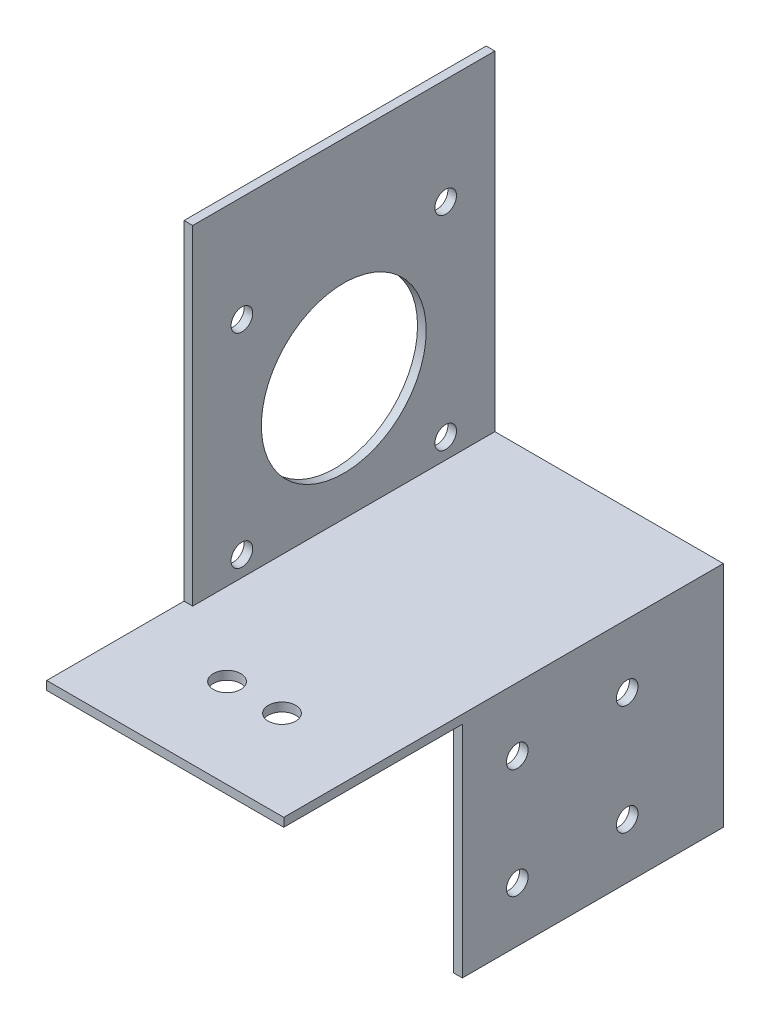
ISO-10303-21;
HEADER;
FILE_DESCRIPTION(('STEP AP214'),'2;1');
FILE_NAME('part.step','',(''),(''),'','','');
FILE_SCHEMA(('AUTOMOTIVE_DESIGN { 1 0 10303 214 1 1 1 1 }'));
ENDSEC;
DATA;
#1=APPLICATION_CONTEXT('core data for automotive mechanical design processes');
#2=APPLICATION_PROTOCOL_DEFINITION('international standard','automotive_design',2000,#1);
#3=PRODUCT_CONTEXT('',#1,'mechanical');
#4=PRODUCT('Part','Part','',(#3));
#5=PRODUCT_RELATED_PRODUCT_CATEGORY('part','',(#4));
#6=PRODUCT_DEFINITION_FORMATION('','',#4);
#7=PRODUCT_DEFINITION_CONTEXT('part definition',#1,'design');
#8=PRODUCT_DEFINITION('design','',#6,#7);
#9=PRODUCT_DEFINITION_SHAPE('','',#8);
#10=(LENGTH_UNIT() NAMED_UNIT(*) SI_UNIT(.MILLI.,.METRE.));
#11=(NAMED_UNIT(*) PLANE_ANGLE_UNIT() SI_UNIT($,.RADIAN.));
#12=(NAMED_UNIT(*) SI_UNIT($,.STERADIAN.) SOLID_ANGLE_UNIT());
#13=UNCERTAINTY_MEASURE_WITH_UNIT(LENGTH_MEASURE(1.E-05),#10,'distance_accuracy_value','');
#14=(GEOMETRIC_REPRESENTATION_CONTEXT(3) GLOBAL_UNCERTAINTY_ASSIGNED_CONTEXT((#13)) GLOBAL_UNIT_ASSIGNED_CONTEXT((#10,
#11,#12)) REPRESENTATION_CONTEXT('',''));
#15=CARTESIAN_POINT('',(0.,0.,0.));
#16=DIRECTION('',(0.,0.,1.));
#17=DIRECTION('',(1.,0.,0.));
#18=AXIS2_PLACEMENT_3D('',#15,#16,#17);
#19=CARTESIAN_POINT('',(-54.8,27.4,25.4));
#20=DIRECTION('',(0.,0.,-1.));
#21=DIRECTION('',(0.,1.,0.));
#22=AXIS2_PLACEMENT_3D('',#19,#20,#21);
#23=PLANE('',#22);
#24=DIRECTION('',(1.,0.,0.));
#25=VECTOR('',#24,1.);
#26=CARTESIAN_POINT('',(-54.8,25.4,25.4));
#27=LINE('',#26,#25);
#28=CARTESIAN_POINT('',(-2.,25.4,25.4));
#29=VERTEX_POINT('',#28);
#30=CARTESIAN_POINT('',(0.,25.4,25.4));
#31=VERTEX_POINT('',#30);
#32=EDGE_CURVE('E11',#29,#31,#27,.T.);
#33=ORIENTED_EDGE('',*,*,#32,.F.);
#34=DIRECTION('',(0.,-1.,0.));
#35=VECTOR('',#34,1.);
#36=CARTESIAN_POINT('',(-2.,0.,25.4));
#37=LINE('',#36,#35);
#38=CARTESIAN_POINT('',(-2.,-25.4,25.4));
#39=VERTEX_POINT('',#38);
#40=EDGE_CURVE('E175',#29,#39,#37,.T.);
#41=ORIENTED_EDGE('',*,*,#40,.T.);
#42=DIRECTION('',(1.,0.,0.));
#43=VECTOR('',#42,1.);
#44=CARTESIAN_POINT('',(-54.8,-25.4,25.4));
#45=LINE('',#44,#43);
#46=CARTESIAN_POINT('',(0.,-25.4,25.4));
#47=VERTEX_POINT('',#46);
#48=EDGE_CURVE('E170',#39,#47,#45,.T.);
#49=ORIENTED_EDGE('',*,*,#48,.T.);
#50=DIRECTION('',(0.,1.,0.));
#51=VECTOR('',#50,1.);
#52=CARTESIAN_POINT('',(0.,27.4,25.4));
#53=LINE('',#52,#51);
#54=EDGE_CURVE('E167',#47,#31,#53,.T.);
#55=ORIENTED_EDGE('',*,*,#54,.T.);
#56=EDGE_LOOP('',(#33,#41,#49,#55));
#57=FACE_BOUND('',#56,.T.);
#58=ADVANCED_FACE('F39',(#57),#23,.F.);
#59=CARTESIAN_POINT('',(0.,27.4,0.));
#60=DIRECTION('',(0.,-1.,0.));
#61=DIRECTION('',(0.,0.,-1.));
#62=AXIS2_PLACEMENT_3D('',#59,#60,#61);
#63=PLANE('',#62);
#64=CARTESIAN_POINT('',(-33.75,27.4,46.0375));
#65=DIRECTION('',(0.,1.,0.));
#66=DIRECTION('',(0.,0.,1.));
#67=AXIS2_PLACEMENT_3D('',#64,#65,#66);
#68=CIRCLE('',#67,3.175);
#69=CARTESIAN_POINT('',(-33.75,27.4,49.2125));
#70=VERTEX_POINT('',#69);
#71=EDGE_CURVE('E307',#70,#70,#68,.T.);
#72=ORIENTED_EDGE('',*,*,#71,.F.);
#73=EDGE_LOOP('',(#72));
#74=FACE_BOUND('',#73,.T.);
#75=CARTESIAN_POINT('',(-21.05,27.4,46.0375));
#76=DIRECTION('',(0.,1.,0.));
#77=DIRECTION('',(0.,0.,1.));
#78=AXIS2_PLACEMENT_3D('',#75,#76,#77);
#79=CIRCLE('',#78,3.175);
#80=CARTESIAN_POINT('',(-21.05,27.4,49.2125));
#81=VERTEX_POINT('',#80);
#82=EDGE_CURVE('E154',#81,#81,#79,.T.);
#83=ORIENTED_EDGE('',*,*,#82,.F.);
#84=EDGE_LOOP('',(#83));
#85=FACE_BOUND('',#84,.T.);
#86=DIRECTION('',(-1.,0.,0.));
#87=VECTOR('',#86,1.);
#88=CARTESIAN_POINT('',(0.,27.4,-34.925));
#89=LINE('',#88,#87);
#90=CARTESIAN_POINT('',(0.,27.4,-34.925));
#91=VERTEX_POINT('',#90);
#92=CARTESIAN_POINT('',(-52.8,27.4,-34.925));
#93=VERTEX_POINT('',#92);
#94=EDGE_CURVE('E129',#91,#93,#89,.T.);
#95=ORIENTED_EDGE('',*,*,#94,.T.);
#96=DIRECTION('',(0.,0.,-1.));
#97=VECTOR('',#96,1.);
#98=CARTESIAN_POINT('',(-52.8,27.4,-34.925));
#99=LINE('',#98,#97);
#100=CARTESIAN_POINT('',(-52.8,27.4,34.925));
#101=VERTEX_POINT('',#100);
#102=EDGE_CURVE('E247',#101,#93,#99,.T.);
#103=ORIENTED_EDGE('',*,*,#102,.F.);
#104=DIRECTION('',(1.,0.,0.));
#105=VECTOR('',#104,1.);
#106=CARTESIAN_POINT('',(-54.8,27.4,34.925));
#107=LINE('',#106,#105);
#108=CARTESIAN_POINT('',(-54.8,27.4,34.925));
#109=VERTEX_POINT('',#108);
#110=EDGE_CURVE('E172',#109,#101,#107,.T.);
#111=ORIENTED_EDGE('',*,*,#110,.F.);
#112=DIRECTION('',(0.,0.,-1.));
#113=VECTOR('',#112,1.);
#114=CARTESIAN_POINT('',(-54.8,27.4,66.675));
#115=LINE('',#114,#113);
#116=CARTESIAN_POINT('',(-54.8,27.4,66.675));
#117=VERTEX_POINT('',#116);
#118=EDGE_CURVE('E137',#117,#109,#115,.T.);
#119=ORIENTED_EDGE('',*,*,#118,.F.);
#120=DIRECTION('',(-1.,0.,0.));
#121=VECTOR('',#120,1.);
#122=CARTESIAN_POINT('',(0.,27.4,66.675));
#123=LINE('',#122,#121);
#124=CARTESIAN_POINT('',(0.,27.4,66.675));
#125=VERTEX_POINT('',#124);
#126=EDGE_CURVE('E133',#125,#117,#123,.T.);
#127=ORIENTED_EDGE('',*,*,#126,.F.);
#128=DIRECTION('',(0.,0.,-1.));
#129=VECTOR('',#128,1.);
#130=CARTESIAN_POINT('',(0.,27.4,-34.925));
#131=LINE('',#130,#129);
#132=EDGE_CURVE('E116',#125,#91,#131,.T.);
#133=ORIENTED_EDGE('',*,*,#132,.T.);
#134=EDGE_LOOP('',(#95,#103,#111,#119,#127,#133));
#135=FACE_BOUND('',#134,.T.);
#136=ADVANCED_FACE('F134',(#74,#85,#135),#63,.F.);
#137=CARTESIAN_POINT('',(-2.,-25.4,-34.925));
#138=DIRECTION('',(0.,0.,-1.));
#139=DIRECTION('',(-1.,0.,0.));
#140=AXIS2_PLACEMENT_3D('',#137,#138,#139);
#141=PLANE('',#140);
#142=DIRECTION('',(0.,1.,0.));
#143=VECTOR('',#142,1.);
#144=CARTESIAN_POINT('',(0.,-25.4,-34.925));
#145=LINE('',#144,#143);
#146=CARTESIAN_POINT('',(0.,-25.4,-34.925));
#147=VERTEX_POINT('',#146);
#148=EDGE_CURVE('E124',#147,#91,#145,.T.);
#149=ORIENTED_EDGE('',*,*,#148,.F.);
#150=DIRECTION('',(1.,0.,0.));
#151=VECTOR('',#150,1.);
#152=CARTESIAN_POINT('',(-2.,-25.4,-34.925));
#153=LINE('',#152,#151);
#154=CARTESIAN_POINT('',(-2.,-25.4,-34.925));
#155=VERTEX_POINT('',#154);
#156=EDGE_CURVE('E50',#155,#147,#153,.T.);
#157=ORIENTED_EDGE('',*,*,#156,.F.);
#158=DIRECTION('',(0.,1.,0.));
#159=VECTOR('',#158,1.);
#160=CARTESIAN_POINT('',(-2.,-25.4,-34.925));
#161=LINE('',#160,#159);
#162=CARTESIAN_POINT('',(-2.,25.4,-34.925));
#163=VERTEX_POINT('',#162);
#164=EDGE_CURVE('E289',#155,#163,#161,.T.);
#165=ORIENTED_EDGE('',*,*,#164,.T.);
#166=DIRECTION('',(-1.,0.,0.));
#167=VECTOR('',#166,1.);
#168=CARTESIAN_POINT('',(0.,25.4,-34.925));
#169=LINE('',#168,#167);
#170=CARTESIAN_POINT('',(-54.8,25.4,-34.925));
#171=VERTEX_POINT('',#170);
#172=EDGE_CURVE('E274',#163,#171,#169,.T.);
#173=ORIENTED_EDGE('',*,*,#172,.T.);
#174=DIRECTION('',(0.,-1.,0.));
#175=VECTOR('',#174,1.);
#176=CARTESIAN_POINT('',(-54.8,27.4,-34.925));
#177=LINE('',#176,#175);
#178=CARTESIAN_POINT('',(-54.8,103.6,-34.925));
#179=VERTEX_POINT('',#178);
#180=EDGE_CURVE('E285',#179,#171,#177,.T.);
#181=ORIENTED_EDGE('',*,*,#180,.F.);
#182=DIRECTION('',(-1.,0.,0.));
#183=VECTOR('',#182,1.);
#184=CARTESIAN_POINT('',(-54.8,103.6,-34.925));
#185=LINE('',#184,#183);
#186=CARTESIAN_POINT('',(-52.8,103.6,-34.925));
#187=VERTEX_POINT('',#186);
#188=EDGE_CURVE('E261',#187,#179,#185,.T.);
#189=ORIENTED_EDGE('',*,*,#188,.F.);
#190=DIRECTION('',(0.,-1.,0.));
#191=VECTOR('',#190,1.);
#192=CARTESIAN_POINT('',(-52.8,103.6,-34.925));
#193=LINE('',#192,#191);
#194=EDGE_CURVE('E265',#187,#93,#193,.T.);
#195=ORIENTED_EDGE('',*,*,#194,.T.);
#196=ORIENTED_EDGE('',*,*,#94,.F.);
#197=EDGE_LOOP('',(#149,#157,#165,#173,#181,#189,#195,#196));
#198=FACE_BOUND('',#197,.T.);
#199=ADVANCED_FACE('F41',(#198),#141,.T.);
#200=CARTESIAN_POINT('',(-2.,-25.4,34.925));
#201=DIRECTION('',(0.,-1.,0.));
#202=DIRECTION('',(0.,0.,-1.));
#203=AXIS2_PLACEMENT_3D('',#200,#201,#202);
#204=PLANE('',#203);
#205=ORIENTED_EDGE('',*,*,#48,.F.);
#206=DIRECTION('',(0.,0.,-1.));
#207=VECTOR('',#206,1.);
#208=CARTESIAN_POINT('',(-2.,-25.4,34.925));
#209=LINE('',#208,#207);
#210=EDGE_CURVE('E58',#39,#155,#209,.T.);
#211=ORIENTED_EDGE('',*,*,#210,.T.);
#212=ORIENTED_EDGE('',*,*,#156,.T.);
#213=DIRECTION('',(0.,0.,-1.));
#214=VECTOR('',#213,1.);
#215=CARTESIAN_POINT('',(0.,-25.4,34.925));
#216=LINE('',#215,#214);
#217=EDGE_CURVE('E294',#47,#147,#216,.T.);
#218=ORIENTED_EDGE('',*,*,#217,.F.);
#219=EDGE_LOOP('',(#205,#211,#212,#218));
#220=FACE_BOUND('',#219,.T.);
#221=ADVANCED_FACE('F327',(#220),#204,.T.);
#222=CARTESIAN_POINT('',(-2.,-25.4,34.925));
#223=DIRECTION('',(0.,0.,1.));
#224=DIRECTION('',(1.,0.,0.));
#225=AXIS2_PLACEMENT_3D('',#222,#223,#224);
#226=PLANE('',#225);
#227=ORIENTED_EDGE('',*,*,#110,.T.);
#228=DIRECTION('',(0.,-1.,0.));
#229=VECTOR('',#228,1.);
#230=CARTESIAN_POINT('',(-52.8,103.6,34.925));
#231=LINE('',#230,#229);
#232=CARTESIAN_POINT('',(-52.8,103.6,34.925));
#233=VERTEX_POINT('',#232);
#234=EDGE_CURVE('E271',#233,#101,#231,.T.);
#235=ORIENTED_EDGE('',*,*,#234,.F.);
#236=DIRECTION('',(1.,0.,0.));
#237=VECTOR('',#236,1.);
#238=CARTESIAN_POINT('',(-54.8,103.6,34.925));
#239=LINE('',#238,#237);
#240=CARTESIAN_POINT('',(-54.8,103.6,34.925));
#241=VERTEX_POINT('',#240);
#242=EDGE_CURVE('E255',#241,#233,#239,.T.);
#243=ORIENTED_EDGE('',*,*,#242,.F.);
#244=DIRECTION('',(0.,-1.,0.));
#245=VECTOR('',#244,1.);
#246=CARTESIAN_POINT('',(-54.8,27.4,34.925));
#247=LINE('',#246,#245);
#248=EDGE_CURVE('E278',#241,#109,#247,.T.);
#249=ORIENTED_EDGE('',*,*,#248,.T.);
#250=EDGE_LOOP('',(#227,#235,#243,#249));
#251=FACE_BOUND('',#250,.T.);
#252=ADVANCED_FACE('F346',(#251),#226,.T.);
#253=CARTESIAN_POINT('',(-2.,0.,0.));
#254=DIRECTION('',(-1.,0.,0.));
#255=DIRECTION('',(0.,0.,1.));
#256=AXIS2_PLACEMENT_3D('',#253,#254,#255);
#257=PLANE('',#256);
#258=ORIENTED_EDGE('',*,*,#40,.F.);
#259=DIRECTION('',(0.,0.,1.));
#260=VECTOR('',#259,1.);
#261=CARTESIAN_POINT('',(-2.,25.4,34.925));
#262=LINE('',#261,#260);
#263=EDGE_CURVE('E293',#163,#29,#262,.T.);
#264=ORIENTED_EDGE('',*,*,#263,.F.);
#265=ORIENTED_EDGE('',*,*,#164,.F.);
#266=ORIENTED_EDGE('',*,*,#210,.F.);
#267=EDGE_LOOP('',(#258,#264,#265,#266));
#268=FACE_BOUND('',#267,.T.);
#269=CARTESIAN_POINT('',(-2.,12.7,12.7));
#270=DIRECTION('',(-1.,0.,0.));
#271=DIRECTION('',(0.,0.,1.));
#272=AXIS2_PLACEMENT_3D('',#269,#270,#271);
#273=CIRCLE('',#272,2.5);
#274=CARTESIAN_POINT('',(-2.,12.7,15.2));
#275=VERTEX_POINT('',#274);
#276=EDGE_CURVE('E206',#275,#275,#273,.T.);
#277=ORIENTED_EDGE('',*,*,#276,.F.);
#278=EDGE_LOOP('',(#277));
#279=FACE_BOUND('',#278,.T.);
#280=CARTESIAN_POINT('',(-2.,12.7,-12.7));
#281=DIRECTION('',(-1.,0.,0.));
#282=DIRECTION('',(0.,0.,1.));
#283=AXIS2_PLACEMENT_3D('',#280,#281,#282);
#284=CIRCLE('',#283,2.5);
#285=CARTESIAN_POINT('',(-2.,12.7,-10.2));
#286=VERTEX_POINT('',#285);
#287=EDGE_CURVE('E202',#286,#286,#284,.T.);
#288=ORIENTED_EDGE('',*,*,#287,.F.);
#289=EDGE_LOOP('',(#288));
#290=FACE_BOUND('',#289,.T.);
#291=CARTESIAN_POINT('',(-2.,-12.7,-12.7));
#292=DIRECTION('',(-1.,0.,0.));
#293=DIRECTION('',(0.,0.,1.));
#294=AXIS2_PLACEMENT_3D('',#291,#292,#293);
#295=CIRCLE('',#294,2.5);
#296=CARTESIAN_POINT('',(-2.,-12.7,-10.2));
#297=VERTEX_POINT('',#296);
#298=EDGE_CURVE('E198',#297,#297,#295,.T.);
#299=ORIENTED_EDGE('',*,*,#298,.F.);
#300=EDGE_LOOP('',(#299));
#301=FACE_BOUND('',#300,.T.);
#302=CARTESIAN_POINT('',(-2.,-12.7,12.7));
#303=DIRECTION('',(-1.,0.,0.));
#304=DIRECTION('',(0.,0.,1.));
#305=AXIS2_PLACEMENT_3D('',#302,#303,#304);
#306=CIRCLE('',#305,2.5);
#307=CARTESIAN_POINT('',(-2.,-12.7,15.2));
#308=VERTEX_POINT('',#307);
#309=EDGE_CURVE('E194',#308,#308,#306,.T.);
#310=ORIENTED_EDGE('',*,*,#309,.F.);
#311=EDGE_LOOP('',(#310));
#312=FACE_BOUND('',#311,.T.);
#313=ADVANCED_FACE('F343',(#268,#279,#290,#301,#312),#257,.T.);
#314=CARTESIAN_POINT('',(0.,0.,0.));
#315=DIRECTION('',(-1.,0.,0.));
#316=DIRECTION('',(0.,0.,1.));
#317=AXIS2_PLACEMENT_3D('',#314,#315,#316);
#318=PLANE('',#317);
#319=CARTESIAN_POINT('',(0.,12.7,12.7));
#320=DIRECTION('',(1.,0.,0.));
#321=DIRECTION('',(0.,0.,-1.));
#322=AXIS2_PLACEMENT_3D('',#319,#320,#321);
#323=CIRCLE('',#322,2.5);
#324=CARTESIAN_POINT('',(0.,12.7,10.2));
#325=VERTEX_POINT('',#324);
#326=EDGE_CURVE('E171',#325,#325,#323,.T.);
#327=ORIENTED_EDGE('',*,*,#326,.F.);
#328=EDGE_LOOP('',(#327));
#329=FACE_BOUND('',#328,.T.);
#330=CARTESIAN_POINT('',(0.,12.7,-12.7));
#331=DIRECTION('',(1.,0.,0.));
#332=DIRECTION('',(0.,0.,-1.));
#333=AXIS2_PLACEMENT_3D('',#330,#331,#332);
#334=CIRCLE('',#333,2.5);
#335=CARTESIAN_POINT('',(0.,12.7,-15.2));
#336=VERTEX_POINT('',#335);
#337=EDGE_CURVE('E181',#336,#336,#334,.T.);
#338=ORIENTED_EDGE('',*,*,#337,.F.);
#339=EDGE_LOOP('',(#338));
#340=FACE_BOUND('',#339,.T.);
#341=CARTESIAN_POINT('',(0.,-12.7,-12.7));
#342=DIRECTION('',(1.,0.,0.));
#343=DIRECTION('',(0.,0.,-1.));
#344=AXIS2_PLACEMENT_3D('',#341,#342,#343);
#345=CIRCLE('',#344,2.5);
#346=CARTESIAN_POINT('',(0.,-12.7,-15.2));
#347=VERTEX_POINT('',#346);
#348=EDGE_CURVE('E185',#347,#347,#345,.T.);
#349=ORIENTED_EDGE('',*,*,#348,.F.);
#350=EDGE_LOOP('',(#349));
#351=FACE_BOUND('',#350,.T.);
#352=CARTESIAN_POINT('',(0.,-12.7,12.7));
#353=DIRECTION('',(1.,0.,0.));
#354=DIRECTION('',(0.,0.,-1.));
#355=AXIS2_PLACEMENT_3D('',#352,#353,#354);
#356=CIRCLE('',#355,2.5);
#357=CARTESIAN_POINT('',(0.,-12.7,10.2));
#358=VERTEX_POINT('',#357);
#359=EDGE_CURVE('E166',#358,#358,#356,.T.);
#360=ORIENTED_EDGE('',*,*,#359,.F.);
#361=EDGE_LOOP('',(#360));
#362=FACE_BOUND('',#361,.T.);
#363=ORIENTED_EDGE('',*,*,#132,.F.);
#364=DIRECTION('',(0.,1.,0.));
#365=VECTOR('',#364,1.);
#366=CARTESIAN_POINT('',(0.,27.4,66.675));
#367=LINE('',#366,#365);
#368=CARTESIAN_POINT('',(0.,25.4,66.675));
#369=VERTEX_POINT('',#368);
#370=EDGE_CURVE('E121',#369,#125,#367,.T.);
#371=ORIENTED_EDGE('',*,*,#370,.F.);
#372=DIRECTION('',(0.,0.,-1.));
#373=VECTOR('',#372,1.);
#374=CARTESIAN_POINT('',(0.,25.4,66.675));
#375=LINE('',#374,#373);
#376=EDGE_CURVE('E161',#369,#31,#375,.T.);
#377=ORIENTED_EDGE('',*,*,#376,.T.);
#378=ORIENTED_EDGE('',*,*,#54,.F.);
#379=ORIENTED_EDGE('',*,*,#217,.T.);
#380=ORIENTED_EDGE('',*,*,#148,.T.);
#381=EDGE_LOOP('',(#363,#371,#377,#378,#379,#380));
#382=FACE_BOUND('',#381,.T.);
#383=ADVANCED_FACE('F118',(#329,#340,#351,#362,#382),#318,.F.);
#384=CARTESIAN_POINT('',(-54.8,27.4,-34.925));
#385=DIRECTION('',(1.,0.,0.));
#386=DIRECTION('',(0.,0.,-1.));
#387=AXIS2_PLACEMENT_3D('',#384,#385,#386);
#388=PLANE('',#387);
#389=ORIENTED_EDGE('',*,*,#118,.T.);
#390=ORIENTED_EDGE('',*,*,#248,.F.);
#391=DIRECTION('',(0.,0.,1.));
#392=VECTOR('',#391,1.);
#393=CARTESIAN_POINT('',(-54.8,103.6,-34.925));
#394=LINE('',#393,#392);
#395=EDGE_CURVE('E251',#179,#241,#394,.T.);
#396=ORIENTED_EDGE('',*,*,#395,.F.);
#397=ORIENTED_EDGE('',*,*,#180,.T.);
#398=DIRECTION('',(0.,0.,1.));
#399=VECTOR('',#398,1.);
#400=CARTESIAN_POINT('',(-54.8,25.4,-34.925));
#401=LINE('',#400,#399);
#402=CARTESIAN_POINT('',(-54.8,25.4,66.675));
#403=VERTEX_POINT('',#402);
#404=EDGE_CURVE('E130',#171,#403,#401,.T.);
#405=ORIENTED_EDGE('',*,*,#404,.T.);
#406=DIRECTION('',(0.,-1.,0.));
#407=VECTOR('',#406,1.);
#408=CARTESIAN_POINT('',(-54.8,27.4,66.675));
#409=LINE('',#408,#407);
#410=EDGE_CURVE('E142',#117,#403,#409,.T.);
#411=ORIENTED_EDGE('',*,*,#410,.F.);
#412=EDGE_LOOP('',(#389,#390,#396,#397,#405,#411));
#413=FACE_BOUND('',#412,.T.);
#414=CARTESIAN_POINT('',(-54.8,32.0179581789407,-23.55));
#415=DIRECTION('',(1.,0.,0.));
#416=DIRECTION('',(0.,0.,-1.));
#417=AXIS2_PLACEMENT_3D('',#414,#415,#416);
#418=CIRCLE('',#417,2.5);
#419=CARTESIAN_POINT('',(-54.8,32.0179581789407,-26.05));
#420=VERTEX_POINT('',#419);
#421=EDGE_CURVE('E236',#420,#420,#418,.T.);
#422=ORIENTED_EDGE('',*,*,#421,.T.);
#423=EDGE_LOOP('',(#422));
#424=FACE_BOUND('',#423,.T.);
#425=CARTESIAN_POINT('',(-54.8,32.0179581789407,23.55));
#426=DIRECTION('',(1.,0.,0.));
#427=DIRECTION('',(0.,0.,-1.));
#428=AXIS2_PLACEMENT_3D('',#425,#426,#427);
#429=CIRCLE('',#428,2.5);
#430=CARTESIAN_POINT('',(-54.8,32.0179581789407,21.05));
#431=VERTEX_POINT('',#430);
#432=EDGE_CURVE('E228',#431,#431,#429,.T.);
#433=ORIENTED_EDGE('',*,*,#432,.T.);
#434=EDGE_LOOP('',(#433));
#435=FACE_BOUND('',#434,.T.);
#436=CARTESIAN_POINT('',(-54.8,79.1179581789407,23.55));
#437=DIRECTION('',(1.,0.,0.));
#438=DIRECTION('',(0.,0.,-1.));
#439=AXIS2_PLACEMENT_3D('',#436,#437,#438);
#440=CIRCLE('',#439,2.5);
#441=CARTESIAN_POINT('',(-54.8,79.1179581789407,21.05));
#442=VERTEX_POINT('',#441);
#443=EDGE_CURVE('E220',#442,#442,#440,.T.);
#444=ORIENTED_EDGE('',*,*,#443,.T.);
#445=EDGE_LOOP('',(#444));
#446=FACE_BOUND('',#445,.T.);
#447=CARTESIAN_POINT('',(-54.8,79.1179581789407,-23.55));
#448=DIRECTION('',(1.,0.,0.));
#449=DIRECTION('',(0.,0.,-1.));
#450=AXIS2_PLACEMENT_3D('',#447,#448,#449);
#451=CIRCLE('',#450,2.5);
#452=CARTESIAN_POINT('',(-54.8,79.1179581789407,-26.05));
#453=VERTEX_POINT('',#452);
#454=EDGE_CURVE('E211',#453,#453,#451,.T.);
#455=ORIENTED_EDGE('',*,*,#454,.T.);
#456=EDGE_LOOP('',(#455));
#457=FACE_BOUND('',#456,.T.);
#458=CARTESIAN_POINT('',(-54.8,55.5679581789407,0.));
#459=DIRECTION('',(1.,0.,0.));
#460=DIRECTION('',(0.,0.,-1.));
#461=AXIS2_PLACEMENT_3D('',#458,#459,#460);
#462=CIRCLE('',#461,19.05);
#463=CARTESIAN_POINT('',(-54.8,55.5679581789407,-19.05));
#464=VERTEX_POINT('',#463);
#465=EDGE_CURVE('E243',#464,#464,#462,.T.);
#466=ORIENTED_EDGE('',*,*,#465,.T.);
#467=EDGE_LOOP('',(#466));
#468=FACE_BOUND('',#467,.T.);
#469=ADVANCED_FACE('F338',(#413,#424,#435,#446,#457,#468),#388,.F.);
#470=CARTESIAN_POINT('',(0.,25.4,0.));
#471=DIRECTION('',(0.,-1.,0.));
#472=DIRECTION('',(0.,0.,-1.));
#473=AXIS2_PLACEMENT_3D('',#470,#471,#472);
#474=PLANE('',#473);
#475=CARTESIAN_POINT('',(-33.75,25.4,46.0375));
#476=DIRECTION('',(0.,-1.,0.));
#477=DIRECTION('',(0.,0.,-1.));
#478=AXIS2_PLACEMENT_3D('',#475,#476,#477);
#479=CIRCLE('',#478,3.175);
#480=CARTESIAN_POINT('',(-33.75,25.4,42.8625));
#481=VERTEX_POINT('',#480);
#482=EDGE_CURVE('E43',#481,#481,#479,.T.);
#483=ORIENTED_EDGE('',*,*,#482,.F.);
#484=EDGE_LOOP('',(#483));
#485=FACE_BOUND('',#484,.T.);
#486=CARTESIAN_POINT('',(-21.05,25.4,46.0375));
#487=DIRECTION('',(0.,-1.,0.));
#488=DIRECTION('',(0.,0.,-1.));
#489=AXIS2_PLACEMENT_3D('',#486,#487,#488);
#490=CIRCLE('',#489,3.175);
#491=CARTESIAN_POINT('',(-21.05,25.4,42.8625));
#492=VERTEX_POINT('',#491);
#493=EDGE_CURVE('E152',#492,#492,#490,.T.);
#494=ORIENTED_EDGE('',*,*,#493,.F.);
#495=EDGE_LOOP('',(#494));
#496=FACE_BOUND('',#495,.T.);
#497=ORIENTED_EDGE('',*,*,#263,.T.);
#498=ORIENTED_EDGE('',*,*,#32,.T.);
#499=ORIENTED_EDGE('',*,*,#376,.F.);
#500=DIRECTION('',(1.,0.,0.));
#501=VECTOR('',#500,1.);
#502=CARTESIAN_POINT('',(0.,25.4,66.675));
#503=LINE('',#502,#501);
#504=EDGE_CURVE('E146',#403,#369,#503,.T.);
#505=ORIENTED_EDGE('',*,*,#504,.F.);
#506=ORIENTED_EDGE('',*,*,#404,.F.);
#507=ORIENTED_EDGE('',*,*,#172,.F.);
#508=EDGE_LOOP('',(#497,#498,#499,#505,#506,#507));
#509=FACE_BOUND('',#508,.T.);
#510=ADVANCED_FACE('F335',(#485,#496,#509),#474,.T.);
#511=CARTESIAN_POINT('',(-52.8,103.6,-34.925));
#512=DIRECTION('',(-1.,0.,0.));
#513=DIRECTION('',(0.,0.,1.));
#514=AXIS2_PLACEMENT_3D('',#511,#512,#513);
#515=PLANE('',#514);
#516=CARTESIAN_POINT('',(-52.8,32.0179581789407,-23.55));
#517=DIRECTION('',(1.,0.,0.));
#518=DIRECTION('',(0.,0.,-1.));
#519=AXIS2_PLACEMENT_3D('',#516,#517,#518);
#520=CIRCLE('',#519,2.5);
#521=CARTESIAN_POINT('',(-52.8,32.0179581789407,-26.05));
#522=VERTEX_POINT('',#521);
#523=EDGE_CURVE('E210',#522,#522,#520,.T.);
#524=ORIENTED_EDGE('',*,*,#523,.F.);
#525=EDGE_LOOP('',(#524));
#526=FACE_BOUND('',#525,.T.);
#527=CARTESIAN_POINT('',(-52.8,32.0179581789407,23.55));
#528=DIRECTION('',(1.,0.,0.));
#529=DIRECTION('',(0.,0.,-1.));
#530=AXIS2_PLACEMENT_3D('',#527,#528,#529);
#531=CIRCLE('',#530,2.5);
#532=CARTESIAN_POINT('',(-52.8,32.0179581789407,21.05));
#533=VERTEX_POINT('',#532);
#534=EDGE_CURVE('E232',#533,#533,#531,.T.);
#535=ORIENTED_EDGE('',*,*,#534,.F.);
#536=EDGE_LOOP('',(#535));
#537=FACE_BOUND('',#536,.T.);
#538=CARTESIAN_POINT('',(-52.8,79.1179581789407,23.55));
#539=DIRECTION('',(1.,0.,0.));
#540=DIRECTION('',(0.,0.,-1.));
#541=AXIS2_PLACEMENT_3D('',#538,#539,#540);
#542=CIRCLE('',#541,2.5);
#543=CARTESIAN_POINT('',(-52.8,79.1179581789407,21.05));
#544=VERTEX_POINT('',#543);
#545=EDGE_CURVE('E224',#544,#544,#542,.T.);
#546=ORIENTED_EDGE('',*,*,#545,.F.);
#547=EDGE_LOOP('',(#546));
#548=FACE_BOUND('',#547,.T.);
#549=CARTESIAN_POINT('',(-52.8,79.1179581789407,-23.55));
#550=DIRECTION('',(1.,0.,0.));
#551=DIRECTION('',(0.,0.,-1.));
#552=AXIS2_PLACEMENT_3D('',#549,#550,#551);
#553=CIRCLE('',#552,2.5);
#554=CARTESIAN_POINT('',(-52.8,79.1179581789407,-26.05));
#555=VERTEX_POINT('',#554);
#556=EDGE_CURVE('E216',#555,#555,#553,.T.);
#557=ORIENTED_EDGE('',*,*,#556,.F.);
#558=EDGE_LOOP('',(#557));
#559=FACE_BOUND('',#558,.T.);
#560=CARTESIAN_POINT('',(-52.8,55.5679581789407,0.));
#561=DIRECTION('',(1.,0.,0.));
#562=DIRECTION('',(0.,0.,-1.));
#563=AXIS2_PLACEMENT_3D('',#560,#561,#562);
#564=CIRCLE('',#563,19.05);
#565=CARTESIAN_POINT('',(-52.8,55.5679581789407,-19.05));
#566=VERTEX_POINT('',#565);
#567=EDGE_CURVE('E215',#566,#566,#564,.T.);
#568=ORIENTED_EDGE('',*,*,#567,.F.);
#569=EDGE_LOOP('',(#568));
#570=FACE_BOUND('',#569,.T.);
#571=ORIENTED_EDGE('',*,*,#102,.T.);
#572=ORIENTED_EDGE('',*,*,#194,.F.);
#573=DIRECTION('',(0.,0.,-1.));
#574=VECTOR('',#573,1.);
#575=CARTESIAN_POINT('',(-52.8,103.6,-34.925));
#576=LINE('',#575,#574);
#577=EDGE_CURVE('E258',#233,#187,#576,.T.);
#578=ORIENTED_EDGE('',*,*,#577,.F.);
#579=ORIENTED_EDGE('',*,*,#234,.T.);
#580=EDGE_LOOP('',(#571,#572,#578,#579));
#581=FACE_BOUND('',#580,.T.);
#582=ADVANCED_FACE('F333',(#526,#537,#548,#559,#570,#581),#515,.F.);
#583=CARTESIAN_POINT('',(0.,103.6,0.));
#584=DIRECTION('',(0.,1.,0.));
#585=DIRECTION('',(0.,0.,1.));
#586=AXIS2_PLACEMENT_3D('',#583,#584,#585);
#587=PLANE('',#586);
#588=ORIENTED_EDGE('',*,*,#395,.T.);
#589=ORIENTED_EDGE('',*,*,#242,.T.);
#590=ORIENTED_EDGE('',*,*,#577,.T.);
#591=ORIENTED_EDGE('',*,*,#188,.T.);
#592=EDGE_LOOP('',(#588,#589,#590,#591));
#593=FACE_BOUND('',#592,.T.);
#594=ADVANCED_FACE('F365',(#593),#587,.T.);
#595=CARTESIAN_POINT('',(-54.8,55.5679581789407,0.));
#596=DIRECTION('',(1.,0.,0.));
#597=DIRECTION('',(0.,0.,-1.));
#598=AXIS2_PLACEMENT_3D('',#595,#596,#597);
#599=CYLINDRICAL_SURFACE('',#598,19.05);
#600=ORIENTED_EDGE('',*,*,#465,.F.);
#601=EDGE_LOOP('',(#600));
#602=FACE_BOUND('',#601,.T.);
#603=ORIENTED_EDGE('',*,*,#567,.T.);
#604=EDGE_LOOP('',(#603));
#605=FACE_BOUND('',#604,.T.);
#606=ADVANCED_FACE('F407',(#602,#605),#599,.F.);
#607=CARTESIAN_POINT('',(-54.8,79.1179581789407,-23.55));
#608=DIRECTION('',(1.,0.,0.));
#609=DIRECTION('',(0.,0.,-1.));
#610=AXIS2_PLACEMENT_3D('',#607,#608,#609);
#611=CYLINDRICAL_SURFACE('',#610,2.5);
#612=ORIENTED_EDGE('',*,*,#454,.F.);
#613=EDGE_LOOP('',(#612));
#614=FACE_BOUND('',#613,.T.);
#615=ORIENTED_EDGE('',*,*,#556,.T.);
#616=EDGE_LOOP('',(#615));
#617=FACE_BOUND('',#616,.T.);
#618=ADVANCED_FACE('F403',(#614,#617),#611,.F.);
#619=CARTESIAN_POINT('',(-54.8,79.1179581789407,23.55));
#620=DIRECTION('',(1.,0.,0.));
#621=DIRECTION('',(0.,0.,-1.));
#622=AXIS2_PLACEMENT_3D('',#619,#620,#621);
#623=CYLINDRICAL_SURFACE('',#622,2.5);
#624=ORIENTED_EDGE('',*,*,#443,.F.);
#625=EDGE_LOOP('',(#624));
#626=FACE_BOUND('',#625,.T.);
#627=ORIENTED_EDGE('',*,*,#545,.T.);
#628=EDGE_LOOP('',(#627));
#629=FACE_BOUND('',#628,.T.);
#630=ADVANCED_FACE('F406',(#626,#629),#623,.F.);
#631=CARTESIAN_POINT('',(-54.8,32.0179581789407,23.55));
#632=DIRECTION('',(1.,0.,0.));
#633=DIRECTION('',(0.,0.,-1.));
#634=AXIS2_PLACEMENT_3D('',#631,#632,#633);
#635=CYLINDRICAL_SURFACE('',#634,2.5);
#636=ORIENTED_EDGE('',*,*,#432,.F.);
#637=EDGE_LOOP('',(#636));
#638=FACE_BOUND('',#637,.T.);
#639=ORIENTED_EDGE('',*,*,#534,.T.);
#640=EDGE_LOOP('',(#639));
#641=FACE_BOUND('',#640,.T.);
#642=ADVANCED_FACE('F398',(#638,#641),#635,.F.);
#643=CARTESIAN_POINT('',(-54.8,32.0179581789407,-23.55));
#644=DIRECTION('',(1.,0.,0.));
#645=DIRECTION('',(0.,0.,-1.));
#646=AXIS2_PLACEMENT_3D('',#643,#644,#645);
#647=CYLINDRICAL_SURFACE('',#646,2.5);
#648=ORIENTED_EDGE('',*,*,#421,.F.);
#649=EDGE_LOOP('',(#648));
#650=FACE_BOUND('',#649,.T.);
#651=ORIENTED_EDGE('',*,*,#523,.T.);
#652=EDGE_LOOP('',(#651));
#653=FACE_BOUND('',#652,.T.);
#654=ADVANCED_FACE('F387',(#650,#653),#647,.F.);
#655=CARTESIAN_POINT('',(-54.8,-12.7,12.7));
#656=DIRECTION('',(1.,0.,0.));
#657=DIRECTION('',(0.,0.,-1.));
#658=AXIS2_PLACEMENT_3D('',#655,#656,#657);
#659=CYLINDRICAL_SURFACE('',#658,2.5);
#660=ORIENTED_EDGE('',*,*,#309,.T.);
#661=EDGE_LOOP('',(#660));
#662=FACE_BOUND('',#661,.T.);
#663=ORIENTED_EDGE('',*,*,#359,.T.);
#664=EDGE_LOOP('',(#663));
#665=FACE_BOUND('',#664,.T.);
#666=ADVANCED_FACE('F383',(#662,#665),#659,.F.);
#667=CARTESIAN_POINT('',(-54.8,-12.7,-12.7));
#668=DIRECTION('',(1.,0.,0.));
#669=DIRECTION('',(0.,0.,-1.));
#670=AXIS2_PLACEMENT_3D('',#667,#668,#669);
#671=CYLINDRICAL_SURFACE('',#670,2.5);
#672=ORIENTED_EDGE('',*,*,#298,.T.);
#673=EDGE_LOOP('',(#672));
#674=FACE_BOUND('',#673,.T.);
#675=ORIENTED_EDGE('',*,*,#348,.T.);
#676=EDGE_LOOP('',(#675));
#677=FACE_BOUND('',#676,.T.);
#678=ADVANCED_FACE('F386',(#674,#677),#671,.F.);
#679=CARTESIAN_POINT('',(-54.8,12.7,-12.7));
#680=DIRECTION('',(1.,0.,0.));
#681=DIRECTION('',(0.,0.,-1.));
#682=AXIS2_PLACEMENT_3D('',#679,#680,#681);
#683=CYLINDRICAL_SURFACE('',#682,2.5);
#684=ORIENTED_EDGE('',*,*,#287,.T.);
#685=EDGE_LOOP('',(#684));
#686=FACE_BOUND('',#685,.T.);
#687=ORIENTED_EDGE('',*,*,#337,.T.);
#688=EDGE_LOOP('',(#687));
#689=FACE_BOUND('',#688,.T.);
#690=ADVANCED_FACE('F395',(#686,#689),#683,.F.);
#691=CARTESIAN_POINT('',(-54.8,12.7,12.7));
#692=DIRECTION('',(1.,0.,0.));
#693=DIRECTION('',(0.,0.,-1.));
#694=AXIS2_PLACEMENT_3D('',#691,#692,#693);
#695=CYLINDRICAL_SURFACE('',#694,2.5);
#696=ORIENTED_EDGE('',*,*,#276,.T.);
#697=EDGE_LOOP('',(#696));
#698=FACE_BOUND('',#697,.T.);
#699=ORIENTED_EDGE('',*,*,#326,.T.);
#700=EDGE_LOOP('',(#699));
#701=FACE_BOUND('',#700,.T.);
#702=ADVANCED_FACE('F478',(#698,#701),#695,.F.);
#703=CARTESIAN_POINT('',(0.,0.,66.675));
#704=DIRECTION('',(0.,0.,-1.));
#705=DIRECTION('',(-1.,0.,0.));
#706=AXIS2_PLACEMENT_3D('',#703,#704,#705);
#707=PLANE('',#706);
#708=ORIENTED_EDGE('',*,*,#370,.T.);
#709=ORIENTED_EDGE('',*,*,#126,.T.);
#710=ORIENTED_EDGE('',*,*,#410,.T.);
#711=ORIENTED_EDGE('',*,*,#504,.T.);
#712=EDGE_LOOP('',(#708,#709,#710,#711));
#713=FACE_BOUND('',#712,.T.);
#714=ADVANCED_FACE('F144',(#713),#707,.F.);
#715=CARTESIAN_POINT('',(-21.05,-25.4,46.0375));
#716=DIRECTION('',(0.,1.,0.));
#717=DIRECTION('',(0.,0.,1.));
#718=AXIS2_PLACEMENT_3D('',#715,#716,#717);
#719=CYLINDRICAL_SURFACE('',#718,3.175);
#720=ORIENTED_EDGE('',*,*,#493,.T.);
#721=EDGE_LOOP('',(#720));
#722=FACE_BOUND('',#721,.T.);
#723=ORIENTED_EDGE('',*,*,#82,.T.);
#724=EDGE_LOOP('',(#723));
#725=FACE_BOUND('',#724,.T.);
#726=ADVANCED_FACE('F318',(#722,#725),#719,.F.);
#727=CARTESIAN_POINT('',(-33.75,-25.4,46.0375));
#728=DIRECTION('',(0.,1.,0.));
#729=DIRECTION('',(0.,0.,1.));
#730=AXIS2_PLACEMENT_3D('',#727,#728,#729);
#731=CYLINDRICAL_SURFACE('',#730,3.175);
#732=ORIENTED_EDGE('',*,*,#482,.T.);
#733=EDGE_LOOP('',(#732));
#734=FACE_BOUND('',#733,.T.);
#735=ORIENTED_EDGE('',*,*,#71,.T.);
#736=EDGE_LOOP('',(#735));
#737=FACE_BOUND('',#736,.T.);
#738=ADVANCED_FACE('F594',(#734,#737),#731,.F.);
#739=CLOSED_SHELL('',(#58,#136,#199,#221,#252,#313,#383,#469,#510,#582,#594,#606,#618,#630,#642,
#654,#666,#678,#690,#702,#714,#726,#738));
#740=MANIFOLD_SOLID_BREP('B2',#739);
#741=ADVANCED_BREP_SHAPE_REPRESENTATION('',(#18,#740),#14);
#742=SHAPE_DEFINITION_REPRESENTATION(#9,#741);
ENDSEC;
END-ISO-10303-21;
